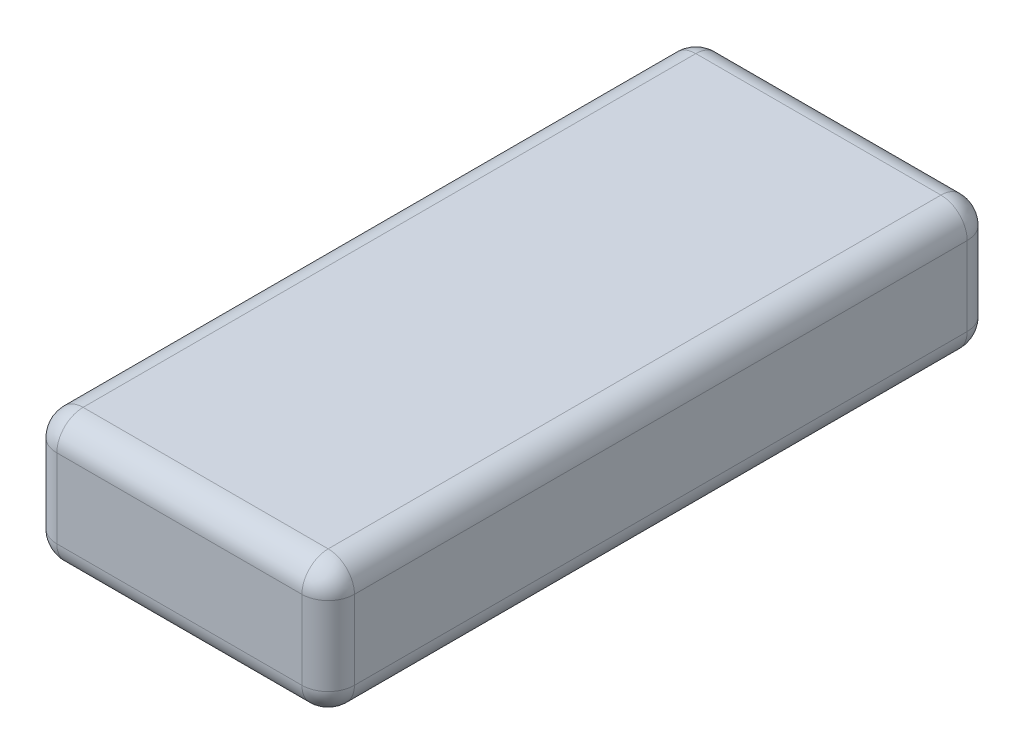
ISO-10303-21;
HEADER;
FILE_DESCRIPTION(('STEP AP214'),'2;1');
FILE_NAME('part.step','',(''),(''),'','','');
FILE_SCHEMA(('AUTOMOTIVE_DESIGN { 1 0 10303 214 1 1 1 1 }'));
ENDSEC;
DATA;
#1=APPLICATION_CONTEXT('core data for automotive mechanical design processes');
#2=APPLICATION_PROTOCOL_DEFINITION('international standard','automotive_design',2000,#1);
#3=PRODUCT_CONTEXT('',#1,'mechanical');
#4=PRODUCT('Part','Part','',(#3));
#5=PRODUCT_RELATED_PRODUCT_CATEGORY('part','',(#4));
#6=PRODUCT_DEFINITION_FORMATION('','',#4);
#7=PRODUCT_DEFINITION_CONTEXT('part definition',#1,'design');
#8=PRODUCT_DEFINITION('design','',#6,#7);
#9=PRODUCT_DEFINITION_SHAPE('','',#8);
#10=(LENGTH_UNIT() NAMED_UNIT(*) SI_UNIT(.MILLI.,.METRE.));
#11=(NAMED_UNIT(*) PLANE_ANGLE_UNIT() SI_UNIT($,.RADIAN.));
#12=(NAMED_UNIT(*) SI_UNIT($,.STERADIAN.) SOLID_ANGLE_UNIT());
#13=UNCERTAINTY_MEASURE_WITH_UNIT(LENGTH_MEASURE(1.E-05),#10,'distance_accuracy_value','');
#14=(GEOMETRIC_REPRESENTATION_CONTEXT(3) GLOBAL_UNCERTAINTY_ASSIGNED_CONTEXT((#13)) GLOBAL_UNIT_ASSIGNED_CONTEXT((#10,
#11,#12)) REPRESENTATION_CONTEXT('',''));
#15=CARTESIAN_POINT('',(0.,0.,0.));
#16=DIRECTION('',(0.,0.,1.));
#17=DIRECTION('',(1.,0.,0.));
#18=AXIS2_PLACEMENT_3D('',#15,#16,#17);
#19=CARTESIAN_POINT('',(17.,15.,-38.));
#20=DIRECTION('',(-1.,0.,0.));
#21=DIRECTION('',(0.,0.,1.));
#22=AXIS2_PLACEMENT_3D('',#19,#20,#21);
#23=PLANE('',#22);
#24=DIRECTION('',(0.,-1.,0.));
#25=VECTOR('',#24,1.);
#26=CARTESIAN_POINT('',(17.,15.,35.));
#27=LINE('',#26,#25);
#28=CARTESIAN_POINT('',(17.,12.,35.));
#29=VERTEX_POINT('',#28);
#30=CARTESIAN_POINT('',(17.,3.,35.));
#31=VERTEX_POINT('',#30);
#32=EDGE_CURVE('E184',#29,#31,#27,.T.);
#33=ORIENTED_EDGE('',*,*,#32,.T.);
#34=DIRECTION('',(0.,0.,-1.));
#35=VECTOR('',#34,1.);
#36=CARTESIAN_POINT('',(17.,3.,-38.));
#37=LINE('',#36,#35);
#38=CARTESIAN_POINT('',(17.,3.,-35.));
#39=VERTEX_POINT('',#38);
#40=EDGE_CURVE('E187',#31,#39,#37,.T.);
#41=ORIENTED_EDGE('',*,*,#40,.T.);
#42=DIRECTION('',(0.,-1.,0.));
#43=VECTOR('',#42,1.);
#44=CARTESIAN_POINT('',(17.,15.,-35.));
#45=LINE('',#44,#43);
#46=CARTESIAN_POINT('',(17.,12.,-35.));
#47=VERTEX_POINT('',#46);
#48=EDGE_CURVE('E182',#39,#47,#45,.F.);
#49=ORIENTED_EDGE('',*,*,#48,.T.);
#50=DIRECTION('',(0.,0.,-1.));
#51=VECTOR('',#50,1.);
#52=CARTESIAN_POINT('',(17.,12.,38.));
#53=LINE('',#52,#51);
#54=EDGE_CURVE('E180',#47,#29,#53,.F.);
#55=ORIENTED_EDGE('',*,*,#54,.T.);
#56=EDGE_LOOP('',(#33,#41,#49,#55));
#57=FACE_BOUND('',#56,.T.);
#58=ADVANCED_FACE('F33',(#57),#23,.F.);
#59=CARTESIAN_POINT('',(-17.,15.,-38.));
#60=DIRECTION('',(0.,0.,1.));
#61=DIRECTION('',(1.,0.,0.));
#62=AXIS2_PLACEMENT_3D('',#59,#60,#61);
#63=PLANE('',#62);
#64=DIRECTION('',(0.,-1.,0.));
#65=VECTOR('',#64,1.);
#66=CARTESIAN_POINT('',(14.,15.,-38.));
#67=LINE('',#66,#65);
#68=CARTESIAN_POINT('',(14.,12.,-38.));
#69=VERTEX_POINT('',#68);
#70=CARTESIAN_POINT('',(14.,3.,-38.));
#71=VERTEX_POINT('',#70);
#72=EDGE_CURVE('E166',#69,#71,#67,.T.);
#73=ORIENTED_EDGE('',*,*,#72,.T.);
#74=DIRECTION('',(-1.,0.,0.));
#75=VECTOR('',#74,1.);
#76=CARTESIAN_POINT('',(-17.,3.,-38.));
#77=LINE('',#76,#75);
#78=CARTESIAN_POINT('',(-14.,3.,-38.));
#79=VERTEX_POINT('',#78);
#80=EDGE_CURVE('E171',#71,#79,#77,.T.);
#81=ORIENTED_EDGE('',*,*,#80,.T.);
#82=DIRECTION('',(0.,-1.,0.));
#83=VECTOR('',#82,1.);
#84=CARTESIAN_POINT('',(-14.,15.,-38.));
#85=LINE('',#84,#83);
#86=CARTESIAN_POINT('',(-14.,12.,-38.));
#87=VERTEX_POINT('',#86);
#88=EDGE_CURVE('E168',#79,#87,#85,.F.);
#89=ORIENTED_EDGE('',*,*,#88,.T.);
#90=DIRECTION('',(-1.,0.,0.));
#91=VECTOR('',#90,1.);
#92=CARTESIAN_POINT('',(17.,12.,-38.));
#93=LINE('',#92,#91);
#94=EDGE_CURVE('E164',#87,#69,#93,.F.);
#95=ORIENTED_EDGE('',*,*,#94,.T.);
#96=EDGE_LOOP('',(#73,#81,#89,#95));
#97=FACE_BOUND('',#96,.T.);
#98=ADVANCED_FACE('F305',(#97),#63,.F.);
#99=CARTESIAN_POINT('',(-17.,15.,-38.));
#100=DIRECTION('',(1.,0.,0.));
#101=DIRECTION('',(0.,0.,-1.));
#102=AXIS2_PLACEMENT_3D('',#99,#100,#101);
#103=PLANE('',#102);
#104=DIRECTION('',(0.,-1.,0.));
#105=VECTOR('',#104,1.);
#106=CARTESIAN_POINT('',(-17.,15.,-35.));
#107=LINE('',#106,#105);
#108=CARTESIAN_POINT('',(-17.,12.,-35.));
#109=VERTEX_POINT('',#108);
#110=CARTESIAN_POINT('',(-17.,3.,-35.));
#111=VERTEX_POINT('',#110);
#112=EDGE_CURVE('E132',#109,#111,#107,.T.);
#113=ORIENTED_EDGE('',*,*,#112,.T.);
#114=DIRECTION('',(0.,0.,1.));
#115=VECTOR('',#114,1.);
#116=CARTESIAN_POINT('',(-17.,3.,-38.));
#117=LINE('',#116,#115);
#118=CARTESIAN_POINT('',(-17.,3.,35.));
#119=VERTEX_POINT('',#118);
#120=EDGE_CURVE('E128',#111,#119,#117,.T.);
#121=ORIENTED_EDGE('',*,*,#120,.T.);
#122=DIRECTION('',(0.,-1.,0.));
#123=VECTOR('',#122,1.);
#124=CARTESIAN_POINT('',(-17.,15.,35.));
#125=LINE('',#124,#123);
#126=CARTESIAN_POINT('',(-17.,12.,35.));
#127=VERTEX_POINT('',#126);
#128=EDGE_CURVE('E120',#119,#127,#125,.F.);
#129=ORIENTED_EDGE('',*,*,#128,.T.);
#130=DIRECTION('',(0.,0.,1.));
#131=VECTOR('',#130,1.);
#132=CARTESIAN_POINT('',(-17.,12.,-38.));
#133=LINE('',#132,#131);
#134=EDGE_CURVE('E125',#127,#109,#133,.F.);
#135=ORIENTED_EDGE('',*,*,#134,.T.);
#136=EDGE_LOOP('',(#113,#121,#129,#135));
#137=FACE_BOUND('',#136,.T.);
#138=ADVANCED_FACE('F123',(#137),#103,.F.);
#139=CARTESIAN_POINT('',(-17.,15.,38.));
#140=DIRECTION('',(0.,0.,-1.));
#141=DIRECTION('',(-1.,0.,0.));
#142=AXIS2_PLACEMENT_3D('',#139,#140,#141);
#143=PLANE('',#142);
#144=DIRECTION('',(0.,-1.,0.));
#145=VECTOR('',#144,1.);
#146=CARTESIAN_POINT('',(-14.,15.,38.));
#147=LINE('',#146,#145);
#148=CARTESIAN_POINT('',(-14.,12.,38.));
#149=VERTEX_POINT('',#148);
#150=CARTESIAN_POINT('',(-14.,3.,38.));
#151=VERTEX_POINT('',#150);
#152=EDGE_CURVE('E140',#149,#151,#147,.T.);
#153=ORIENTED_EDGE('',*,*,#152,.T.);
#154=DIRECTION('',(1.,0.,0.));
#155=VECTOR('',#154,1.);
#156=CARTESIAN_POINT('',(-17.,3.,38.));
#157=LINE('',#156,#155);
#158=CARTESIAN_POINT('',(14.,3.,38.));
#159=VERTEX_POINT('',#158);
#160=EDGE_CURVE('E178',#151,#159,#157,.T.);
#161=ORIENTED_EDGE('',*,*,#160,.T.);
#162=DIRECTION('',(0.,-1.,0.));
#163=VECTOR('',#162,1.);
#164=CARTESIAN_POINT('',(14.,15.,38.));
#165=LINE('',#164,#163);
#166=CARTESIAN_POINT('',(14.,12.,38.));
#167=VERTEX_POINT('',#166);
#168=EDGE_CURVE('E175',#159,#167,#165,.F.);
#169=ORIENTED_EDGE('',*,*,#168,.T.);
#170=DIRECTION('',(1.,0.,0.));
#171=VECTOR('',#170,1.);
#172=CARTESIAN_POINT('',(-17.,12.,38.));
#173=LINE('',#172,#171);
#174=EDGE_CURVE('E173',#167,#149,#173,.F.);
#175=ORIENTED_EDGE('',*,*,#174,.T.);
#176=EDGE_LOOP('',(#153,#161,#169,#175));
#177=FACE_BOUND('',#176,.T.);
#178=ADVANCED_FACE('F296',(#177),#143,.F.);
#179=CARTESIAN_POINT('',(0.,15.,0.));
#180=DIRECTION('',(0.,1.,0.));
#181=DIRECTION('',(0.,0.,1.));
#182=AXIS2_PLACEMENT_3D('',#179,#180,#181);
#183=PLANE('',#182);
#184=DIRECTION('',(0.,0.,1.));
#185=VECTOR('',#184,1.);
#186=CARTESIAN_POINT('',(-14.,15.,38.));
#187=LINE('',#186,#185);
#188=CARTESIAN_POINT('',(-14.,15.,-35.));
#189=VERTEX_POINT('',#188);
#190=CARTESIAN_POINT('',(-14.,15.,35.));
#191=VERTEX_POINT('',#190);
#192=EDGE_CURVE('E42',#189,#191,#187,.T.);
#193=ORIENTED_EDGE('',*,*,#192,.T.);
#194=DIRECTION('',(1.,0.,0.));
#195=VECTOR('',#194,1.);
#196=CARTESIAN_POINT('',(17.,15.,35.));
#197=LINE('',#196,#195);
#198=CARTESIAN_POINT('',(14.,15.,35.));
#199=VERTEX_POINT('',#198);
#200=EDGE_CURVE('E11',#191,#199,#197,.T.);
#201=ORIENTED_EDGE('',*,*,#200,.T.);
#202=DIRECTION('',(0.,0.,-1.));
#203=VECTOR('',#202,1.);
#204=CARTESIAN_POINT('',(14.,15.,-38.));
#205=LINE('',#204,#203);
#206=CARTESIAN_POINT('',(14.,15.,-35.));
#207=VERTEX_POINT('',#206);
#208=EDGE_CURVE('E198',#199,#207,#205,.T.);
#209=ORIENTED_EDGE('',*,*,#208,.T.);
#210=DIRECTION('',(-1.,0.,0.));
#211=VECTOR('',#210,1.);
#212=CARTESIAN_POINT('',(-17.,15.,-35.));
#213=LINE('',#212,#211);
#214=EDGE_CURVE('E53',#207,#189,#213,.T.);
#215=ORIENTED_EDGE('',*,*,#214,.T.);
#216=EDGE_LOOP('',(#193,#201,#209,#215));
#217=FACE_BOUND('',#216,.T.);
#218=ADVANCED_FACE('F298',(#217),#183,.T.);
#219=CARTESIAN_POINT('',(0.,0.,0.));
#220=DIRECTION('',(0.,1.,0.));
#221=DIRECTION('',(0.,0.,1.));
#222=AXIS2_PLACEMENT_3D('',#219,#220,#221);
#223=PLANE('',#222);
#224=DIRECTION('',(0.,0.,1.));
#225=VECTOR('',#224,1.);
#226=CARTESIAN_POINT('',(-14.,0.,0.));
#227=LINE('',#226,#225);
#228=CARTESIAN_POINT('',(-14.,0.,35.));
#229=VERTEX_POINT('',#228);
#230=CARTESIAN_POINT('',(-14.,0.,-35.));
#231=VERTEX_POINT('',#230);
#232=EDGE_CURVE('E193',#229,#231,#227,.F.);
#233=ORIENTED_EDGE('',*,*,#232,.T.);
#234=DIRECTION('',(-1.,0.,0.));
#235=VECTOR('',#234,1.);
#236=CARTESIAN_POINT('',(0.,0.,-35.));
#237=LINE('',#236,#235);
#238=CARTESIAN_POINT('',(14.,0.,-35.));
#239=VERTEX_POINT('',#238);
#240=EDGE_CURVE('E195',#231,#239,#237,.F.);
#241=ORIENTED_EDGE('',*,*,#240,.T.);
#242=DIRECTION('',(0.,0.,-1.));
#243=VECTOR('',#242,1.);
#244=CARTESIAN_POINT('',(14.,0.,0.));
#245=LINE('',#244,#243);
#246=CARTESIAN_POINT('',(14.,0.,35.));
#247=VERTEX_POINT('',#246);
#248=EDGE_CURVE('E189',#239,#247,#245,.F.);
#249=ORIENTED_EDGE('',*,*,#248,.T.);
#250=DIRECTION('',(1.,0.,0.));
#251=VECTOR('',#250,1.);
#252=CARTESIAN_POINT('',(0.,0.,35.));
#253=LINE('',#252,#251);
#254=EDGE_CURVE('E191',#247,#229,#253,.F.);
#255=ORIENTED_EDGE('',*,*,#254,.T.);
#256=EDGE_LOOP('',(#233,#241,#249,#255));
#257=FACE_BOUND('',#256,.T.);
#258=ADVANCED_FACE('F265',(#257),#223,.F.);
#259=CARTESIAN_POINT('',(14.,15.,35.));
#260=DIRECTION('',(0.,-1.,0.));
#261=DIRECTION('',(0.,0.,-1.));
#262=AXIS2_PLACEMENT_3D('',#259,#260,#261);
#263=CYLINDRICAL_SURFACE('',#262,3.);
#264=CARTESIAN_POINT('',(14.,12.,35.));
#265=DIRECTION('',(0.,1.,0.));
#266=DIRECTION('',(0.,0.,1.));
#267=AXIS2_PLACEMENT_3D('',#264,#265,#266);
#268=CIRCLE('',#267,3.);
#269=EDGE_CURVE('E37',#167,#29,#268,.T.);
#270=ORIENTED_EDGE('',*,*,#269,.F.);
#271=ORIENTED_EDGE('',*,*,#168,.F.);
#272=CARTESIAN_POINT('',(14.,3.,35.));
#273=DIRECTION('',(0.,-1.,0.));
#274=DIRECTION('',(0.,0.,-1.));
#275=AXIS2_PLACEMENT_3D('',#272,#273,#274);
#276=CIRCLE('',#275,3.);
#277=EDGE_CURVE('E160',#31,#159,#276,.T.);
#278=ORIENTED_EDGE('',*,*,#277,.F.);
#279=ORIENTED_EDGE('',*,*,#32,.F.);
#280=EDGE_LOOP('',(#270,#271,#278,#279));
#281=FACE_BOUND('',#280,.T.);
#282=ADVANCED_FACE('F35',(#281),#263,.T.);
#283=CARTESIAN_POINT('',(14.,12.,35.));
#284=DIRECTION('',(0.,0.,1.));
#285=DIRECTION('',(1.,0.,0.));
#286=AXIS2_PLACEMENT_3D('',#283,#284,#285);
#287=SPHERICAL_SURFACE('',#286,3.);
#288=CARTESIAN_POINT('',(14.,12.,35.));
#289=DIRECTION('',(1.,0.,0.));
#290=DIRECTION('',(0.,0.,-1.));
#291=AXIS2_PLACEMENT_3D('',#288,#289,#290);
#292=CIRCLE('',#291,3.);
#293=EDGE_CURVE('E244',#167,#199,#292,.F.);
#294=ORIENTED_EDGE('',*,*,#293,.F.);
#295=ORIENTED_EDGE('',*,*,#269,.T.);
#296=CARTESIAN_POINT('',(14.,12.,35.));
#297=DIRECTION('',(0.,0.,1.));
#298=DIRECTION('',(1.,0.,0.));
#299=AXIS2_PLACEMENT_3D('',#296,#297,#298);
#300=CIRCLE('',#299,3.);
#301=EDGE_CURVE('E247',#199,#29,#300,.F.);
#302=ORIENTED_EDGE('',*,*,#301,.F.);
#303=EDGE_LOOP('',(#294,#295,#302));
#304=FACE_BOUND('',#303,.T.);
#305=ADVANCED_FACE('F291',(#304),#287,.T.);
#306=CARTESIAN_POINT('',(14.,3.,35.));
#307=DIRECTION('',(0.,0.,1.));
#308=DIRECTION('',(1.,0.,0.));
#309=AXIS2_PLACEMENT_3D('',#306,#307,#308);
#310=SPHERICAL_SURFACE('',#309,3.);
#311=CARTESIAN_POINT('',(14.,3.,35.));
#312=DIRECTION('',(0.,0.,1.));
#313=DIRECTION('',(1.,0.,0.));
#314=AXIS2_PLACEMENT_3D('',#311,#312,#313);
#315=CIRCLE('',#314,3.);
#316=EDGE_CURVE('E238',#31,#247,#315,.F.);
#317=ORIENTED_EDGE('',*,*,#316,.F.);
#318=ORIENTED_EDGE('',*,*,#277,.T.);
#319=CARTESIAN_POINT('',(14.,3.,35.));
#320=DIRECTION('',(1.,0.,0.));
#321=DIRECTION('',(0.,0.,-1.));
#322=AXIS2_PLACEMENT_3D('',#319,#320,#321);
#323=CIRCLE('',#322,3.);
#324=EDGE_CURVE('E241',#247,#159,#323,.F.);
#325=ORIENTED_EDGE('',*,*,#324,.F.);
#326=EDGE_LOOP('',(#317,#318,#325));
#327=FACE_BOUND('',#326,.T.);
#328=ADVANCED_FACE('F254',(#327),#310,.T.);
#329=CARTESIAN_POINT('',(14.,12.,0.));
#330=DIRECTION('',(0.,0.,1.));
#331=DIRECTION('',(1.,0.,0.));
#332=AXIS2_PLACEMENT_3D('',#329,#330,#331);
#333=CYLINDRICAL_SURFACE('',#332,3.);
#334=ORIENTED_EDGE('',*,*,#301,.T.);
#335=ORIENTED_EDGE('',*,*,#54,.F.);
#336=CARTESIAN_POINT('',(14.,12.,-35.));
#337=DIRECTION('',(0.,0.,-1.));
#338=DIRECTION('',(-1.,0.,0.));
#339=AXIS2_PLACEMENT_3D('',#336,#337,#338);
#340=CIRCLE('',#339,3.);
#341=EDGE_CURVE('E232',#207,#47,#340,.T.);
#342=ORIENTED_EDGE('',*,*,#341,.F.);
#343=ORIENTED_EDGE('',*,*,#208,.F.);
#344=EDGE_LOOP('',(#334,#335,#342,#343));
#345=FACE_BOUND('',#344,.T.);
#346=ADVANCED_FACE('F286',(#345),#333,.T.);
#347=CARTESIAN_POINT('',(0.,12.,35.));
#348=DIRECTION('',(-1.,0.,0.));
#349=DIRECTION('',(0.,0.,1.));
#350=AXIS2_PLACEMENT_3D('',#347,#348,#349);
#351=CYLINDRICAL_SURFACE('',#350,3.);
#352=ORIENTED_EDGE('',*,*,#293,.T.);
#353=ORIENTED_EDGE('',*,*,#200,.F.);
#354=CARTESIAN_POINT('',(-14.,12.,35.));
#355=DIRECTION('',(-1.,0.,0.));
#356=DIRECTION('',(0.,0.,1.));
#357=AXIS2_PLACEMENT_3D('',#354,#355,#356);
#358=CIRCLE('',#357,3.);
#359=EDGE_CURVE('E144',#149,#191,#358,.T.);
#360=ORIENTED_EDGE('',*,*,#359,.F.);
#361=ORIENTED_EDGE('',*,*,#174,.F.);
#362=EDGE_LOOP('',(#352,#353,#360,#361));
#363=FACE_BOUND('',#362,.T.);
#364=ADVANCED_FACE('F294',(#363),#351,.T.);
#365=CARTESIAN_POINT('',(-14.,15.,35.));
#366=DIRECTION('',(0.,-1.,0.));
#367=DIRECTION('',(0.,0.,-1.));
#368=AXIS2_PLACEMENT_3D('',#365,#366,#367);
#369=CYLINDRICAL_SURFACE('',#368,3.);
#370=CARTESIAN_POINT('',(-14.,3.,35.));
#371=DIRECTION('',(0.,-1.,0.));
#372=DIRECTION('',(0.,0.,-1.));
#373=AXIS2_PLACEMENT_3D('',#370,#371,#372);
#374=CIRCLE('',#373,3.);
#375=EDGE_CURVE('E145',#151,#119,#374,.T.);
#376=ORIENTED_EDGE('',*,*,#375,.F.);
#377=ORIENTED_EDGE('',*,*,#152,.F.);
#378=CARTESIAN_POINT('',(-14.,12.,35.));
#379=DIRECTION('',(0.,1.,0.));
#380=DIRECTION('',(0.,0.,1.));
#381=AXIS2_PLACEMENT_3D('',#378,#379,#380);
#382=CIRCLE('',#381,3.);
#383=EDGE_CURVE('E136',#127,#149,#382,.T.);
#384=ORIENTED_EDGE('',*,*,#383,.F.);
#385=ORIENTED_EDGE('',*,*,#128,.F.);
#386=EDGE_LOOP('',(#376,#377,#384,#385));
#387=FACE_BOUND('',#386,.T.);
#388=ADVANCED_FACE('F138',(#387),#369,.T.);
#389=CARTESIAN_POINT('',(-17.,3.,35.));
#390=DIRECTION('',(1.,0.,0.));
#391=DIRECTION('',(0.,0.,-1.));
#392=AXIS2_PLACEMENT_3D('',#389,#390,#391);
#393=CYLINDRICAL_SURFACE('',#392,3.);
#394=ORIENTED_EDGE('',*,*,#324,.T.);
#395=ORIENTED_EDGE('',*,*,#160,.F.);
#396=CARTESIAN_POINT('',(-14.,3.,35.));
#397=DIRECTION('',(-1.,0.,0.));
#398=DIRECTION('',(0.,0.,1.));
#399=AXIS2_PLACEMENT_3D('',#396,#397,#398);
#400=CIRCLE('',#399,3.);
#401=EDGE_CURVE('E228',#229,#151,#400,.T.);
#402=ORIENTED_EDGE('',*,*,#401,.F.);
#403=ORIENTED_EDGE('',*,*,#254,.F.);
#404=EDGE_LOOP('',(#394,#395,#402,#403));
#405=FACE_BOUND('',#404,.T.);
#406=ADVANCED_FACE('F261',(#405),#393,.T.);
#407=CARTESIAN_POINT('',(14.,3.,-38.));
#408=DIRECTION('',(0.,0.,-1.));
#409=DIRECTION('',(-1.,0.,0.));
#410=AXIS2_PLACEMENT_3D('',#407,#408,#409);
#411=CYLINDRICAL_SURFACE('',#410,3.);
#412=ORIENTED_EDGE('',*,*,#316,.T.);
#413=ORIENTED_EDGE('',*,*,#248,.F.);
#414=CARTESIAN_POINT('',(14.,3.,-35.));
#415=DIRECTION('',(0.,0.,-1.));
#416=DIRECTION('',(-1.,0.,0.));
#417=AXIS2_PLACEMENT_3D('',#414,#415,#416);
#418=CIRCLE('',#417,3.);
#419=EDGE_CURVE('E225',#39,#239,#418,.T.);
#420=ORIENTED_EDGE('',*,*,#419,.F.);
#421=ORIENTED_EDGE('',*,*,#40,.F.);
#422=EDGE_LOOP('',(#412,#413,#420,#421));
#423=FACE_BOUND('',#422,.T.);
#424=ADVANCED_FACE('F271',(#423),#411,.T.);
#425=CARTESIAN_POINT('',(14.,15.,-35.));
#426=DIRECTION('',(0.,-1.,0.));
#427=DIRECTION('',(0.,0.,-1.));
#428=AXIS2_PLACEMENT_3D('',#425,#426,#427);
#429=CYLINDRICAL_SURFACE('',#428,3.);
#430=CARTESIAN_POINT('',(14.,12.,-35.));
#431=DIRECTION('',(0.,1.,0.));
#432=DIRECTION('',(0.,0.,1.));
#433=AXIS2_PLACEMENT_3D('',#430,#431,#432);
#434=CIRCLE('',#433,3.);
#435=EDGE_CURVE('E235',#47,#69,#434,.T.);
#436=ORIENTED_EDGE('',*,*,#435,.F.);
#437=ORIENTED_EDGE('',*,*,#48,.F.);
#438=CARTESIAN_POINT('',(14.,3.,-35.));
#439=DIRECTION('',(0.,-1.,0.));
#440=DIRECTION('',(0.,0.,-1.));
#441=AXIS2_PLACEMENT_3D('',#438,#439,#440);
#442=CIRCLE('',#441,3.);
#443=EDGE_CURVE('E222',#71,#39,#442,.T.);
#444=ORIENTED_EDGE('',*,*,#443,.F.);
#445=ORIENTED_EDGE('',*,*,#72,.F.);
#446=EDGE_LOOP('',(#436,#437,#444,#445));
#447=FACE_BOUND('',#446,.T.);
#448=ADVANCED_FACE('F278',(#447),#429,.T.);
#449=CARTESIAN_POINT('',(14.,12.,-35.));
#450=DIRECTION('',(0.,0.,1.));
#451=DIRECTION('',(1.,0.,0.));
#452=AXIS2_PLACEMENT_3D('',#449,#450,#451);
#453=SPHERICAL_SURFACE('',#452,3.);
#454=ORIENTED_EDGE('',*,*,#341,.T.);
#455=ORIENTED_EDGE('',*,*,#435,.T.);
#456=CARTESIAN_POINT('',(14.,12.,-35.));
#457=DIRECTION('',(1.,0.,0.));
#458=DIRECTION('',(0.,0.,-1.));
#459=AXIS2_PLACEMENT_3D('',#456,#457,#458);
#460=CIRCLE('',#459,3.);
#461=EDGE_CURVE('E151',#207,#69,#460,.F.);
#462=ORIENTED_EDGE('',*,*,#461,.F.);
#463=EDGE_LOOP('',(#454,#455,#462));
#464=FACE_BOUND('',#463,.T.);
#465=ADVANCED_FACE('F284',(#464),#453,.T.);
#466=CARTESIAN_POINT('',(-14.,12.,35.));
#467=DIRECTION('',(0.,0.,1.));
#468=DIRECTION('',(1.,0.,0.));
#469=AXIS2_PLACEMENT_3D('',#466,#467,#468);
#470=SPHERICAL_SURFACE('',#469,3.);
#471=ORIENTED_EDGE('',*,*,#383,.T.);
#472=ORIENTED_EDGE('',*,*,#359,.T.);
#473=CARTESIAN_POINT('',(-14.,12.,35.));
#474=DIRECTION('',(0.,0.,1.));
#475=DIRECTION('',(1.,0.,0.));
#476=AXIS2_PLACEMENT_3D('',#473,#474,#475);
#477=CIRCLE('',#476,3.);
#478=EDGE_CURVE('E148',#127,#191,#477,.F.);
#479=ORIENTED_EDGE('',*,*,#478,.F.);
#480=EDGE_LOOP('',(#471,#472,#479));
#481=FACE_BOUND('',#480,.T.);
#482=ADVANCED_FACE('F149',(#481),#470,.T.);
#483=CARTESIAN_POINT('',(-14.,3.,35.));
#484=DIRECTION('',(0.,0.,1.));
#485=DIRECTION('',(1.,0.,0.));
#486=AXIS2_PLACEMENT_3D('',#483,#484,#485);
#487=SPHERICAL_SURFACE('',#486,3.);
#488=ORIENTED_EDGE('',*,*,#401,.T.);
#489=ORIENTED_EDGE('',*,*,#375,.T.);
#490=CARTESIAN_POINT('',(-14.,3.,35.));
#491=DIRECTION('',(0.,0.,1.));
#492=DIRECTION('',(1.,0.,0.));
#493=AXIS2_PLACEMENT_3D('',#490,#491,#492);
#494=CIRCLE('',#493,3.);
#495=EDGE_CURVE('E152',#229,#119,#494,.F.);
#496=ORIENTED_EDGE('',*,*,#495,.F.);
#497=EDGE_LOOP('',(#488,#489,#496));
#498=FACE_BOUND('',#497,.T.);
#499=ADVANCED_FACE('F345',(#498),#487,.T.);
#500=CARTESIAN_POINT('',(14.,3.,-35.));
#501=DIRECTION('',(0.,0.,1.));
#502=DIRECTION('',(1.,0.,0.));
#503=AXIS2_PLACEMENT_3D('',#500,#501,#502);
#504=SPHERICAL_SURFACE('',#503,3.);
#505=ORIENTED_EDGE('',*,*,#443,.T.);
#506=ORIENTED_EDGE('',*,*,#419,.T.);
#507=CARTESIAN_POINT('',(14.,3.,-35.));
#508=DIRECTION('',(1.,0.,0.));
#509=DIRECTION('',(0.,0.,-1.));
#510=AXIS2_PLACEMENT_3D('',#507,#508,#509);
#511=CIRCLE('',#510,3.);
#512=EDGE_CURVE('E216',#71,#239,#511,.F.);
#513=ORIENTED_EDGE('',*,*,#512,.F.);
#514=EDGE_LOOP('',(#505,#506,#513));
#515=FACE_BOUND('',#514,.T.);
#516=ADVANCED_FACE('F341',(#515),#504,.T.);
#517=CARTESIAN_POINT('',(0.,12.,-35.));
#518=DIRECTION('',(1.,0.,0.));
#519=DIRECTION('',(0.,0.,-1.));
#520=AXIS2_PLACEMENT_3D('',#517,#518,#519);
#521=CYLINDRICAL_SURFACE('',#520,3.);
#522=ORIENTED_EDGE('',*,*,#461,.T.);
#523=ORIENTED_EDGE('',*,*,#94,.F.);
#524=CARTESIAN_POINT('',(-14.,12.,-35.));
#525=DIRECTION('',(-1.,0.,0.));
#526=DIRECTION('',(0.,0.,1.));
#527=AXIS2_PLACEMENT_3D('',#524,#525,#526);
#528=CIRCLE('',#527,3.);
#529=EDGE_CURVE('E213',#189,#87,#528,.T.);
#530=ORIENTED_EDGE('',*,*,#529,.F.);
#531=ORIENTED_EDGE('',*,*,#214,.F.);
#532=EDGE_LOOP('',(#522,#523,#530,#531));
#533=FACE_BOUND('',#532,.T.);
#534=ADVANCED_FACE('F338',(#533),#521,.T.);
#535=CARTESIAN_POINT('',(-14.,12.,0.));
#536=DIRECTION('',(0.,0.,-1.));
#537=DIRECTION('',(-1.,0.,0.));
#538=AXIS2_PLACEMENT_3D('',#535,#536,#537);
#539=CYLINDRICAL_SURFACE('',#538,3.);
#540=ORIENTED_EDGE('',*,*,#478,.T.);
#541=ORIENTED_EDGE('',*,*,#192,.F.);
#542=CARTESIAN_POINT('',(-14.,12.,-35.));
#543=DIRECTION('',(0.,0.,-1.));
#544=DIRECTION('',(-1.,0.,0.));
#545=AXIS2_PLACEMENT_3D('',#542,#543,#544);
#546=CIRCLE('',#545,3.);
#547=EDGE_CURVE('E156',#109,#189,#546,.T.);
#548=ORIENTED_EDGE('',*,*,#547,.F.);
#549=ORIENTED_EDGE('',*,*,#134,.F.);
#550=EDGE_LOOP('',(#540,#541,#548,#549));
#551=FACE_BOUND('',#550,.T.);
#552=ADVANCED_FACE('F154',(#551),#539,.T.);
#553=CARTESIAN_POINT('',(-14.,3.,-38.));
#554=DIRECTION('',(0.,0.,1.));
#555=DIRECTION('',(1.,0.,0.));
#556=AXIS2_PLACEMENT_3D('',#553,#554,#555);
#557=CYLINDRICAL_SURFACE('',#556,3.);
#558=ORIENTED_EDGE('',*,*,#495,.T.);
#559=ORIENTED_EDGE('',*,*,#120,.F.);
#560=CARTESIAN_POINT('',(-14.,3.,-35.));
#561=DIRECTION('',(0.,0.,-1.));
#562=DIRECTION('',(-1.,0.,0.));
#563=AXIS2_PLACEMENT_3D('',#560,#561,#562);
#564=CIRCLE('',#563,3.);
#565=EDGE_CURVE('E209',#231,#111,#564,.T.);
#566=ORIENTED_EDGE('',*,*,#565,.F.);
#567=ORIENTED_EDGE('',*,*,#232,.F.);
#568=EDGE_LOOP('',(#558,#559,#566,#567));
#569=FACE_BOUND('',#568,.T.);
#570=ADVANCED_FACE('F331',(#569),#557,.T.);
#571=CARTESIAN_POINT('',(-17.,3.,-35.));
#572=DIRECTION('',(-1.,0.,0.));
#573=DIRECTION('',(0.,0.,1.));
#574=AXIS2_PLACEMENT_3D('',#571,#572,#573);
#575=CYLINDRICAL_SURFACE('',#574,3.);
#576=ORIENTED_EDGE('',*,*,#512,.T.);
#577=ORIENTED_EDGE('',*,*,#240,.F.);
#578=CARTESIAN_POINT('',(-14.,3.,-35.));
#579=DIRECTION('',(-1.,0.,0.));
#580=DIRECTION('',(0.,0.,1.));
#581=AXIS2_PLACEMENT_3D('',#578,#579,#580);
#582=CIRCLE('',#581,3.);
#583=EDGE_CURVE('E206',#79,#231,#582,.T.);
#584=ORIENTED_EDGE('',*,*,#583,.F.);
#585=ORIENTED_EDGE('',*,*,#80,.F.);
#586=EDGE_LOOP('',(#576,#577,#584,#585));
#587=FACE_BOUND('',#586,.T.);
#588=ADVANCED_FACE('F327',(#587),#575,.T.);
#589=CARTESIAN_POINT('',(-14.,12.,-35.));
#590=DIRECTION('',(0.,0.,1.));
#591=DIRECTION('',(1.,0.,0.));
#592=AXIS2_PLACEMENT_3D('',#589,#590,#591);
#593=SPHERICAL_SURFACE('',#592,3.);
#594=ORIENTED_EDGE('',*,*,#547,.T.);
#595=ORIENTED_EDGE('',*,*,#529,.T.);
#596=CARTESIAN_POINT('',(-14.,12.,-35.));
#597=DIRECTION('',(0.,1.,0.));
#598=DIRECTION('',(0.,0.,1.));
#599=AXIS2_PLACEMENT_3D('',#596,#597,#598);
#600=CIRCLE('',#599,3.);
#601=EDGE_CURVE('E204',#109,#87,#600,.F.);
#602=ORIENTED_EDGE('',*,*,#601,.F.);
#603=EDGE_LOOP('',(#594,#595,#602));
#604=FACE_BOUND('',#603,.T.);
#605=ADVANCED_FACE('F323',(#604),#593,.T.);
#606=CARTESIAN_POINT('',(-14.,3.,-35.));
#607=DIRECTION('',(0.,0.,1.));
#608=DIRECTION('',(1.,0.,0.));
#609=AXIS2_PLACEMENT_3D('',#606,#607,#608);
#610=SPHERICAL_SURFACE('',#609,3.);
#611=ORIENTED_EDGE('',*,*,#583,.T.);
#612=ORIENTED_EDGE('',*,*,#565,.T.);
#613=CARTESIAN_POINT('',(-14.,3.,-35.));
#614=DIRECTION('',(0.,-1.,0.));
#615=DIRECTION('',(0.,0.,-1.));
#616=AXIS2_PLACEMENT_3D('',#613,#614,#615);
#617=CIRCLE('',#616,3.);
#618=EDGE_CURVE('E202',#79,#111,#617,.F.);
#619=ORIENTED_EDGE('',*,*,#618,.F.);
#620=EDGE_LOOP('',(#611,#612,#619));
#621=FACE_BOUND('',#620,.T.);
#622=ADVANCED_FACE('F319',(#621),#610,.T.);
#623=CARTESIAN_POINT('',(-14.,15.,-35.));
#624=DIRECTION('',(0.,-1.,0.));
#625=DIRECTION('',(0.,0.,-1.));
#626=AXIS2_PLACEMENT_3D('',#623,#624,#625);
#627=CYLINDRICAL_SURFACE('',#626,3.);
#628=ORIENTED_EDGE('',*,*,#601,.T.);
#629=ORIENTED_EDGE('',*,*,#88,.F.);
#630=ORIENTED_EDGE('',*,*,#618,.T.);
#631=ORIENTED_EDGE('',*,*,#112,.F.);
#632=EDGE_LOOP('',(#628,#629,#630,#631));
#633=FACE_BOUND('',#632,.T.);
#634=ADVANCED_FACE('F316',(#633),#627,.T.);
#635=CLOSED_SHELL('',(#58,#98,#138,#178,#218,#258,#282,#305,#328,#346,#364,#388,#406,#424,#448,
#465,#482,#499,#516,#534,#552,#570,#588,#605,#622,#634));
#636=MANIFOLD_SOLID_BREP('B2',#635);
#637=ADVANCED_BREP_SHAPE_REPRESENTATION('',(#18,#636),#14);
#638=SHAPE_DEFINITION_REPRESENTATION(#9,#637);
ENDSEC;
END-ISO-10303-21;
